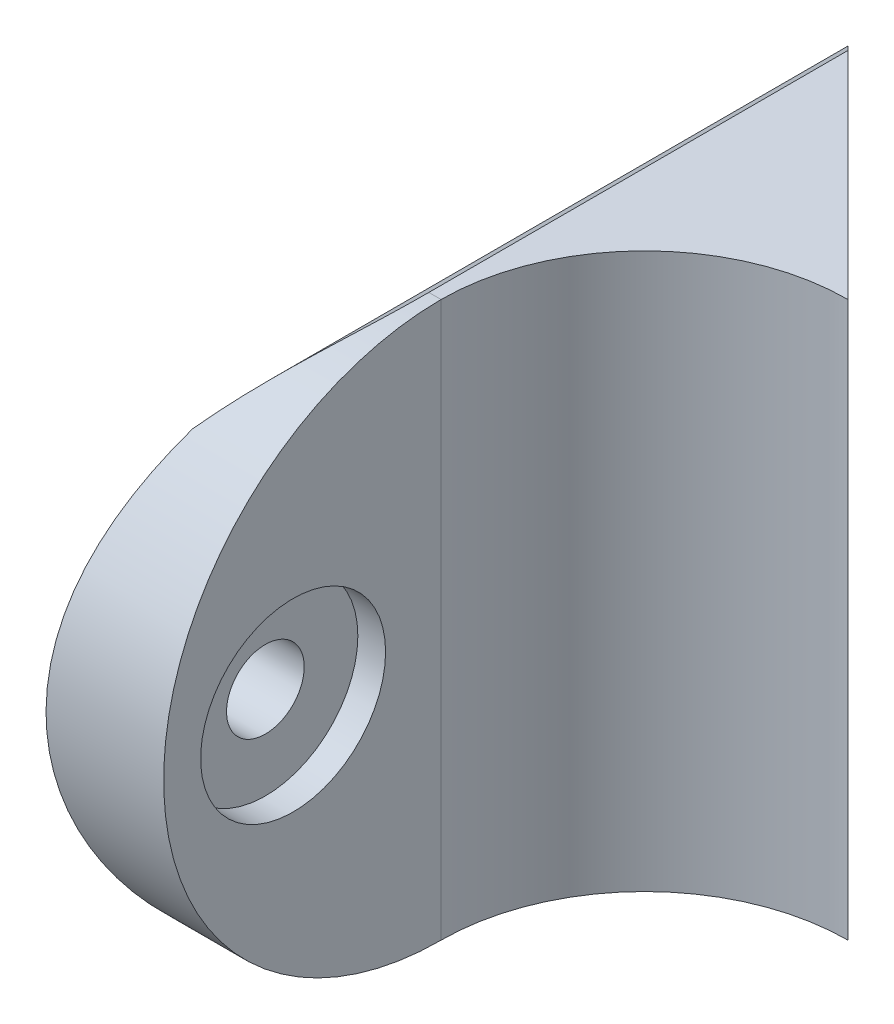
ISO-10303-21;
HEADER;
FILE_DESCRIPTION(('STEP AP214'),'2;1');
FILE_NAME('part.step','',(''),(''),'','','');
FILE_SCHEMA(('AUTOMOTIVE_DESIGN { 1 0 10303 214 1 1 1 1 }'));
ENDSEC;
DATA;
#1=APPLICATION_CONTEXT('core data for automotive mechanical design processes');
#2=APPLICATION_PROTOCOL_DEFINITION('international standard','automotive_design',2000,#1);
#3=PRODUCT_CONTEXT('',#1,'mechanical');
#4=PRODUCT('Part','Part','',(#3));
#5=PRODUCT_RELATED_PRODUCT_CATEGORY('part','',(#4));
#6=PRODUCT_DEFINITION_FORMATION('','',#4);
#7=PRODUCT_DEFINITION_CONTEXT('part definition',#1,'design');
#8=PRODUCT_DEFINITION('design','',#6,#7);
#9=PRODUCT_DEFINITION_SHAPE('','',#8);
#10=(LENGTH_UNIT() NAMED_UNIT(*) SI_UNIT(.MILLI.,.METRE.));
#11=(NAMED_UNIT(*) PLANE_ANGLE_UNIT() SI_UNIT($,.RADIAN.));
#12=(NAMED_UNIT(*) SI_UNIT($,.STERADIAN.) SOLID_ANGLE_UNIT());
#13=UNCERTAINTY_MEASURE_WITH_UNIT(LENGTH_MEASURE(1.E-05),#10,'distance_accuracy_value','');
#14=(GEOMETRIC_REPRESENTATION_CONTEXT(3) GLOBAL_UNCERTAINTY_ASSIGNED_CONTEXT((#13)) GLOBAL_UNIT_ASSIGNED_CONTEXT((#10,
#11,#12)) REPRESENTATION_CONTEXT('',''));
#15=CARTESIAN_POINT('',(0.,0.,0.));
#16=DIRECTION('',(0.,0.,1.));
#17=DIRECTION('',(1.,0.,0.));
#18=AXIS2_PLACEMENT_3D('',#15,#16,#17);
#19=CARTESIAN_POINT('',(-21.,0.,43.));
#20=DIRECTION('',(1.,0.,0.));
#21=DIRECTION('',(0.,0.,-1.));
#22=AXIS2_PLACEMENT_3D('',#19,#20,#21);
#23=CYLINDRICAL_SURFACE('',#22,2.1);
#24=CARTESIAN_POINT('',(-17.359878327988,0.,40.9));
#25=CARTESIAN_POINT('',(-17.3598773552782,0.117803127326626,40.9000051715138));
#26=CARTESIAN_POINT('',(-17.3591769189348,0.235687990237266,40.9099458752845));
#27=CARTESIAN_POINT('',(-17.3564500802148,0.468200495144243,40.9494574222357));
#28=CARTESIAN_POINT('',(-17.3544221480234,0.582824219765412,40.9790509139868));
#29=CARTESIAN_POINT('',(-17.3492696501639,0.805412984687269,41.057011968129));
#30=CARTESIAN_POINT('',(-17.3461456768738,0.913381584901175,41.1053693906611));
#31=CARTESIAN_POINT('',(-17.3391521206936,1.11964183281974,41.2194686016767));
#32=CARTESIAN_POINT('',(-17.3352827049107,1.21793564189313,41.2852064951746));
#33=CARTESIAN_POINT('',(-17.3272249871438,1.40226466954753,41.4323324826434));
#34=CARTESIAN_POINT('',(-17.3230361760479,1.48827966156545,41.5137458920299));
#35=CARTESIAN_POINT('',(-17.3148160910453,1.64543619165883,41.6898591159669));
#36=CARTESIAN_POINT('',(-17.3107848238353,1.71657709804234,41.7845594945203));
#37=CARTESIAN_POINT('',(-17.3033304060286,1.842030986409,41.9846763953724));
#38=CARTESIAN_POINT('',(-17.2999078791114,1.89632675174785,42.0901037360624));
#39=CARTESIAN_POINT('',(-17.294063646182,1.98643902574917,42.3086061849361));
#40=CARTESIAN_POINT('',(-17.2916419271516,2.02225577478247,42.4216811936191));
#41=CARTESIAN_POINT('',(-17.2880773537148,2.07433608374194,42.6520709006064));
#42=CARTESIAN_POINT('',(-17.2869323907341,2.0906318860072,42.7693782772777));
#43=CARTESIAN_POINT('',(-17.2860441395963,2.10330728173906,43.0050684978444));
#44=CARTESIAN_POINT('',(-17.2863008321518,2.09968714925843,43.1234513269187));
#45=CARTESIAN_POINT('',(-17.288184988244,2.07266015147577,43.3577118930659));
#46=CARTESIAN_POINT('',(-17.2898100313425,2.04928822432188,43.4735936831836));
#47=CARTESIAN_POINT('',(-17.294243961714,1.98347530194872,43.699785343894));
#48=CARTESIAN_POINT('',(-17.2970528575516,1.94103416877251,43.8100951741698));
#49=CARTESIAN_POINT('',(-17.3035407555352,1.83824809666536,44.0221235816733));
#50=CARTESIAN_POINT('',(-17.3072205245734,1.77788736572298,44.1238344789118));
#51=CARTESIAN_POINT('',(-17.3150347626347,1.64098693859051,44.3156938548685));
#52=CARTESIAN_POINT('',(-17.3191692381136,1.56444701267509,44.4058421693827));
#53=CARTESIAN_POINT('',(-17.3274377463794,1.3971643747123,44.5722206327364));
#54=CARTESIAN_POINT('',(-17.3315717590453,1.30639143669282,44.6484203956559));
#55=CARTESIAN_POINT('',(-17.3393649647355,1.11332527716711,44.7845041628899));
#56=CARTESIAN_POINT('',(-17.3430241575511,1.01103205059867,44.8443881600351));
#57=CARTESIAN_POINT('',(-17.3494558192857,0.797810177565241,44.9461381614192));
#58=CARTESIAN_POINT('',(-17.3522282284191,0.686880949501239,44.9880029508973));
#59=CARTESIAN_POINT('',(-17.3565731691071,0.459544449340323,45.0525055325618));
#60=CARTESIAN_POINT('',(-17.3581457182389,0.343137257519005,45.0751436064091));
#61=CARTESIAN_POINT('',(-17.3599114850407,0.108412754163054,45.1005123479051));
#62=CARTESIAN_POINT('',(-17.3601076126284,-0.00989999733750644,45.103285013631));
#63=CARTESIAN_POINT('',(-17.359106187304,-0.245308816982658,45.0889540612662));
#64=CARTESIAN_POINT('',(-17.3579086435222,-0.36240489309282,45.0718505733873));
#65=CARTESIAN_POINT('',(-17.3542565154343,-0.591937652970691,45.0182876049569));
#66=CARTESIAN_POINT('',(-17.3518031868102,-0.704378870053084,44.9818474581486));
#67=CARTESIAN_POINT('',(-17.3459153591273,-0.921550206949607,44.890665245067));
#68=CARTESIAN_POINT('',(-17.3424808490262,-1.02628023996477,44.8359229728191));
#69=CARTESIAN_POINT('',(-17.3350090157935,-1.2252482421634,44.709583977226));
#70=CARTESIAN_POINT('',(-17.330970696209,-1.31946840973544,44.6379592784042));
#71=CARTESIAN_POINT('',(-17.3227488162683,-1.49456275117412,44.47992920989));
#72=CARTESIAN_POINT('',(-17.3185652541268,-1.57543676092761,44.393523658469));
#73=CARTESIAN_POINT('',(-17.3105159077264,-1.72168592952491,44.2082030768615));
#74=CARTESIAN_POINT('',(-17.3066506908837,-1.78703378925954,44.1092664750551));
#75=CARTESIAN_POINT('',(-17.2996830415473,-1.90018879653537,43.9018003072294));
#76=CARTESIAN_POINT('',(-17.2965806033839,-1.94799607445812,43.7932708125227));
#77=CARTESIAN_POINT('',(-17.2914925094567,-2.02466582187833,43.5697983232938));
#78=CARTESIAN_POINT('',(-17.2895058501819,-2.05354531858909,43.4548611943006));
#79=CARTESIAN_POINT('',(-17.2868705962817,-2.09159527512911,43.2217549881252));
#80=CARTESIAN_POINT('',(-17.2862219843291,-2.10076599017902,43.103585952815));
#81=CARTESIAN_POINT('',(-17.2863363975873,-2.09913546278256,42.8676416864513));
#82=CARTESIAN_POINT('',(-17.2870963900514,-2.08837712791074,42.7498661550138));
#83=CARTESIAN_POINT('',(-17.2899359438148,-2.04728302027896,42.5177984445883));
#84=CARTESIAN_POINT('',(-17.2920155073976,-2.01694721364218,42.4035062716284));
#85=CARTESIAN_POINT('',(-17.2972591064403,-1.9375693863946,42.1816444572387));
#86=CARTESIAN_POINT('',(-17.3004231191017,-1.88852775903646,42.0740746745395));
#87=CARTESIAN_POINT('',(-17.3074790730021,-1.77313580434715,41.8686893281596));
#88=CARTESIAN_POINT('',(-17.3113709978327,-1.7067858671601,41.7708735446841));
#89=CARTESIAN_POINT('',(-17.3194540791258,-1.55850069282034,41.5875542452822));
#90=CARTESIAN_POINT('',(-17.3236458272448,-1.47653407717275,41.5020761377643));
#91=CARTESIAN_POINT('',(-17.3318509910896,-1.29939133458257,41.3460612211671));
#92=CARTESIAN_POINT('',(-17.3358643630974,-1.20421199265805,41.275528059146));
#93=CARTESIAN_POINT('',(-17.3432657042034,-1.00321297828269,41.1513395555124));
#94=CARTESIAN_POINT('',(-17.3466527653414,-0.897378196452628,41.0977086389546));
#95=CARTESIAN_POINT('',(-17.3524082880172,-0.678257832048794,41.0090444950348));
#96=CARTESIAN_POINT('',(-17.354777934675,-0.564981096517255,40.9739896184374));
#97=CARTESIAN_POINT('',(-17.3576147822055,-0.375849385227733,40.9325238403764));
#98=CARTESIAN_POINT('',(-17.3584598095428,-0.30121502132771,40.9203433143235));
#99=CARTESIAN_POINT('',(-17.3595918938459,-0.151064976224547,40.9040797430476));
#100=CARTESIAN_POINT('',(-17.3598789518046,-0.0755492965900784,40.8999966834138));
#101=CARTESIAN_POINT('',(-17.359878327988,0.,40.9));
#102=B_SPLINE_CURVE_WITH_KNOTS('',3,(#24,#25,#26,#27,#28,#29,#30,#31,#32,#33,#34,#35,#36,#37,
#38,#39,#40,#41,#42,#43,#44,#45,#46,#47,#48,#49,#50,#51,#52,#53,#54,#55,#56,#57,#58,#59,#60,#61,
#62,#63,#64,#65,#66,#67,#68,#69,#70,#71,#72,#73,#74,#75,#76,#77,#78,#79,#80,#81,#82,#83,#84,#85,
#86,#87,#88,#89,#90,#91,#92,#93,#94,#95,#96,#97,#98,#99,#100,#101),.UNSPECIFIED.,.T.,.F.,(4,2,2,
2,2,2,2,2,2,2,2,2,2,2,2,2,2,2,2,2,2,2,2,2,2,2,2,2,2,2,2,2,2,2,2,2,2,2,4),(0.,0.353133570045961,
0.706674811626607,1.0600252681825,1.41329660547348,1.76714332299056,2.12100506507728,
2.47522729052506,2.82944490821496,3.18307666183501,3.53670354932543,3.88970622664898,
4.24271145782552,4.59602871024467,4.94935097968591,5.30343400717363,5.65751719025207,
6.01162424003237,6.36572610224504,6.71907912519491,7.07242983328402,7.42542790780287,
7.77842995514697,8.13202111813854,8.48561662879608,8.83982932832678,9.19403939489244,
9.54793037921384,9.90181678076442,10.2549421444365,10.6080681191573,10.9611866705163,
11.3142972629687,11.6681249871039,12.0220389576475,12.3764620408358,12.7304711521256,
12.956942561706,13.1834135682469),.UNSPECIFIED.);
#103=CARTESIAN_POINT('',(-17.359878327988,0.,40.9));
#104=VERTEX_POINT('',#103);
#105=EDGE_CURVE('E131',#104,#104,#102,.T.);
#106=ORIENTED_EDGE('',*,*,#105,.F.);
#107=EDGE_LOOP('',(#106));
#108=FACE_BOUND('',#107,.T.);
#109=CARTESIAN_POINT('',(-12.5,0.,43.));
#110=DIRECTION('',(1.,0.,0.));
#111=DIRECTION('',(0.,0.,-1.));
#112=AXIS2_PLACEMENT_3D('',#109,#110,#111);
#113=CIRCLE('',#112,2.1);
#114=CARTESIAN_POINT('',(-12.5,0.,40.9));
#115=VERTEX_POINT('',#114);
#116=EDGE_CURVE('E40',#115,#115,#113,.F.);
#117=ORIENTED_EDGE('',*,*,#116,.F.);
#118=EDGE_LOOP('',(#117));
#119=FACE_BOUND('',#118,.T.);
#120=ADVANCED_FACE('F35',(#108,#119),#23,.F.);
#121=CARTESIAN_POINT('',(-11.,-15.,35.));
#122=DIRECTION('',(-1.,0.,0.));
#123=DIRECTION('',(0.,0.,1.));
#124=AXIS2_PLACEMENT_3D('',#121,#122,#123);
#125=PLANE('',#124);
#126=CARTESIAN_POINT('',(-11.,0.,43.));
#127=DIRECTION('',(1.,0.,0.));
#128=DIRECTION('',(0.,0.,-1.));
#129=AXIS2_PLACEMENT_3D('',#126,#127,#128);
#130=CIRCLE('',#129,5.);
#131=CARTESIAN_POINT('',(-11.,0.,38.));
#132=VERTEX_POINT('',#131);
#133=EDGE_CURVE('E337',#132,#132,#130,.T.);
#134=ORIENTED_EDGE('',*,*,#133,.F.);
#135=EDGE_LOOP('',(#134));
#136=FACE_BOUND('',#135,.T.);
#137=CARTESIAN_POINT('',(-11.,0.,35.));
#138=DIRECTION('',(-1.,0.,0.));
#139=DIRECTION('',(0.,0.,1.));
#140=AXIS2_PLACEMENT_3D('',#137,#138,#139);
#141=CIRCLE('',#140,15.);
#142=CARTESIAN_POINT('',(-11.,15.,35.));
#143=VERTEX_POINT('',#142);
#144=CARTESIAN_POINT('',(-11.,-15.,35.));
#145=VERTEX_POINT('',#144);
#146=EDGE_CURVE('E11',#143,#145,#141,.F.);
#147=ORIENTED_EDGE('',*,*,#146,.T.);
#148=DIRECTION('',(0.,1.,0.));
#149=VECTOR('',#148,1.);
#150=CARTESIAN_POINT('',(-11.,-15.,35.));
#151=LINE('',#150,#149);
#152=EDGE_CURVE('E137',#145,#143,#151,.T.);
#153=ORIENTED_EDGE('',*,*,#152,.T.);
#154=EDGE_LOOP('',(#147,#153));
#155=FACE_BOUND('',#154,.T.);
#156=ADVANCED_FACE('F142',(#136,#155),#125,.F.);
#157=CARTESIAN_POINT('',(12.6351057446877,0.,50.));
#158=DIRECTION('',(0.,0.,-1.));
#159=DIRECTION('',(-1.,0.,0.));
#160=AXIS2_PLACEMENT_3D('',#157,#158,#159);
#161=CYLINDRICAL_SURFACE('',#160,29.9949840726757);
#162=ORIENTED_EDGE('',*,*,#105,.T.);
#163=EDGE_LOOP('',(#162));
#164=FACE_BOUND('',#163,.T.);
#165=DIRECTION('',(0.,0.,-1.));
#166=VECTOR('',#165,1.);
#167=CARTESIAN_POINT('',(-15.,-11.6619037896906,50.));
#168=LINE('',#167,#166);
#169=CARTESIAN_POINT('',(-15.,-11.6619037896906,44.4339811320566));
#170=VERTEX_POINT('',#169);
#171=CARTESIAN_POINT('',(-15.,-11.6619037896906,9.00000000000016));
#172=VERTEX_POINT('',#171);
#173=EDGE_CURVE('E151',#170,#172,#168,.T.);
#174=ORIENTED_EDGE('',*,*,#173,.F.);
#175=CARTESIAN_POINT('',(-15.,-11.6619037896906,44.4339811320566));
#176=CARTESIAN_POINT('',(-15.1120957211379,-11.3963216706343,44.7622791990855));
#177=CARTESIAN_POINT('',(-15.2254042103931,-11.1170818582388,45.0791155664624));
#178=CARTESIAN_POINT('',(-15.4515199959078,-10.5327284268078,45.6883039807991));
#179=CARTESIAN_POINT('',(-15.5643271656971,-10.2276086300261,45.9806501484744));
#180=CARTESIAN_POINT('',(-15.7869155074399,-9.59175586830694,46.5402910792367));
#181=CARTESIAN_POINT('',(-15.8966822677662,-9.26092238306328,46.8074774621032));
#182=CARTESIAN_POINT('',(-16.1098474105829,-8.57643166097236,47.313650221142));
#183=CARTESIAN_POINT('',(-16.2132462442515,-8.22277604475586,47.5526385962921));
#184=CARTESIAN_POINT('',(-16.4111985812117,-7.49361823023179,48.0011273094045));
#185=CARTESIAN_POINT('',(-16.5057302168057,-7.11806554374308,48.2105553574182));
#186=CARTESIAN_POINT('',(-16.6830932650888,-6.34809605883984,48.5973257914563));
#187=CARTESIAN_POINT('',(-16.765924402544,-5.95367881696145,48.774667422731));
#188=CARTESIAN_POINT('',(-16.9173835086777,-5.1494211602852,49.0950504029862));
#189=CARTESIAN_POINT('',(-16.9860392292979,-4.73961277382633,49.2381588608545));
#190=CARTESIAN_POINT('',(-17.1073184377961,-3.90694348283946,49.4887808458075));
#191=CARTESIAN_POINT('',(-17.1599434207373,-3.4840837995587,49.5962976923285));
#192=CARTESIAN_POINT('',(-17.2444907199793,-2.65870389589838,49.7680869399939));
#193=CARTESIAN_POINT('',(-17.2776014404965,-2.25682344368792,49.8348534466609));
#194=CARTESIAN_POINT('',(-17.3276479381946,-1.4479658783483,49.9355099384572));
#195=CARTESIAN_POINT('',(-17.3445844305725,-1.04098899138116,49.9694013772674));
#196=CARTESIAN_POINT('',(-17.3618070818824,-0.225253662544106,50.0038638693639));
#197=CARTESIAN_POINT('',(-17.3620923377367,0.18350487475105,50.0044331154251));
#198=CARTESIAN_POINT('',(-17.3460013578525,0.999366724908656,49.9722380603422));
#199=CARTESIAN_POINT('',(-17.32962578213,1.40647010269855,49.9394750796486));
#200=CARTESIAN_POINT('',(-17.2824273703869,2.18678551993687,49.8445702083344));
#201=CARTESIAN_POINT('',(-17.2527185994086,2.56034337701187,49.7846910659505));
#202=CARTESIAN_POINT('',(-17.1800471819322,3.30061073420406,49.6372262221396));
#203=CARTESIAN_POINT('',(-17.13708525722,3.66732060611929,49.5496420295632));
#204=CARTESIAN_POINT('',(-17.038894279801,4.39162787101356,49.3476476263607));
#205=CARTESIAN_POINT('',(-16.9836636291772,4.74922407023061,49.2332339212676));
#206=CARTESIAN_POINT('',(-16.862172392532,5.45318764214694,48.9786571045386));
#207=CARTESIAN_POINT('',(-16.7959115317523,5.79955473487665,48.8384933514699));
#208=CARTESIAN_POINT('',(-16.6512467393913,6.49137363188892,48.5281516158495));
#209=CARTESIAN_POINT('',(-16.5724938714589,6.83635174257776,48.357081093172));
#210=CARTESIAN_POINT('',(-16.4064278762627,7.51059062207698,47.9899347680066));
#211=CARTESIAN_POINT('',(-16.3191140768805,7.83985015380031,47.7938570018374));
#212=CARTESIAN_POINT('',(-16.1378247180322,8.48106888287473,47.3781036263377));
#213=CARTESIAN_POINT('',(-16.0438505189569,8.79303159004555,47.1584328312016));
#214=CARTESIAN_POINT('',(-15.8512253277107,9.39834553916119,46.6968348920091));
#215=CARTESIAN_POINT('',(-15.7525755028993,9.69170138434198,46.4549132892531));
#216=CARTESIAN_POINT('',(-15.5449964892748,10.2803456738617,45.9307556524684));
#217=CARTESIAN_POINT('',(-15.4358569648111,10.5740767019255,45.6468522553939));
#218=CARTESIAN_POINT('',(-15.2174327724006,11.1367106594027,45.0568119876732));
#219=CARTESIAN_POINT('',(-15.1081490132699,11.4056690538692,44.7507276699081));
#220=CARTESIAN_POINT('',(-15.,11.6619037896906,44.4339811320566));
#221=B_SPLINE_CURVE_WITH_KNOTS('',3,(#175,#176,#177,#178,#179,#180,#181,#182,#183,#184,#185,
#186,#187,#188,#189,#190,#191,#192,#193,#194,#195,#196,#197,#198,#199,#200,#201,#202,#203,#204,
#205,#206,#207,#208,#209,#210,#211,#212,#213,#214,#215,#216,#217,#218,#219,#220),.UNSPECIFIED.,
.F.,.F.,(4,2,2,2,2,2,2,2,2,2,2,2,2,2,2,2,2,2,2,2,2,2,4),(0.,1.31033235921306,2.62097838963238,
3.93703411458703,5.2529964872433,6.57212327282275,7.89128108340413,9.20783129690129,
10.5242586882991,11.7488241747026,12.9733355103838,14.1979132572293,15.4224424945287,
16.559609751518,17.6967150876589,18.8339686108493,19.9712504668295,21.1491144961019,
22.3270710735758,23.5047877422054,24.6822119044985,25.9493923133011,27.2136628346308),.UNSPECIFIED.);
#222=CARTESIAN_POINT('',(-15.,11.6619037896906,44.4339811320566));
#223=VERTEX_POINT('',#222);
#224=EDGE_CURVE('E218',#170,#223,#221,.T.);
#225=ORIENTED_EDGE('',*,*,#224,.T.);
#226=DIRECTION('',(0.,0.,-1.));
#227=VECTOR('',#226,1.);
#228=CARTESIAN_POINT('',(-15.,11.6619037896906,50.));
#229=LINE('',#228,#227);
#230=CARTESIAN_POINT('',(-15.,11.6619037896906,9.00000000000017));
#231=VERTEX_POINT('',#230);
#232=EDGE_CURVE('E143',#223,#231,#229,.T.);
#233=ORIENTED_EDGE('',*,*,#232,.T.);
#234=CARTESIAN_POINT('',(12.6351057446877,0.,36.6351057446876));
#235=DIRECTION('',(-0.707106781186544,0.,0.707106781186551));
#236=DIRECTION('',(-0.707106781186551,0.,-0.707106781186544));
#237=AXIS2_PLACEMENT_3D('',#234,#235,#236);
#238=ELLIPSE('',#237,42.4193132787428,29.9949840726757);
#239=EDGE_CURVE('E276',#231,#172,#238,.T.);
#240=ORIENTED_EDGE('',*,*,#239,.T.);
#241=EDGE_LOOP('',(#174,#225,#233,#240));
#242=FACE_BOUND('',#241,.T.);
#243=CARTESIAN_POINT('',(-16.7536517914871,6.,23.));
#244=CARTESIAN_POINT('',(-16.7241071994618,6.14476772058072,23.0000140300551));
#245=CARTESIAN_POINT('',(-16.6934745392663,6.28930006028608,22.9937135494294));
#246=CARTESIAN_POINT('',(-16.6303293493908,6.5768431082708,22.9687056361636));
#247=CARTESIAN_POINT('',(-16.5978172144413,6.71985412864362,22.9500008001284));
#248=CARTESIAN_POINT('',(-16.5312393506038,7.00318375282971,22.9004377922957));
#249=CARTESIAN_POINT('',(-16.4971756625683,7.14350556718333,22.869595199843));
#250=CARTESIAN_POINT('',(-16.4278040761811,7.42069698571253,22.7960586977326));
#251=CARTESIAN_POINT('',(-16.3924961330744,7.55756646540514,22.7533643613938));
#252=CARTESIAN_POINT('',(-16.3210434778832,7.82687003433335,22.6565022467704));
#253=CARTESIAN_POINT('',(-16.2848992128615,7.95930640473414,22.6023404778055));
#254=CARTESIAN_POINT('',(-16.2121680129478,8.2190058658933,22.4829061656262));
#255=CARTESIAN_POINT('',(-16.1755809202679,8.34626703773404,22.4176295468301));
#256=CARTESIAN_POINT('',(-16.1024404101607,8.5947240050441,22.2764263270041));
#257=CARTESIAN_POINT('',(-16.0658869889588,8.71592059063252,22.2005011182433));
#258=CARTESIAN_POINT('',(-15.9932839105586,8.95151252774411,22.0384431012141));
#259=CARTESIAN_POINT('',(-15.9572344327508,9.06590550226402,21.9523067565379));
#260=CARTESIAN_POINT('',(-15.8856644890068,9.28862799656446,21.7690861258288));
#261=CARTESIAN_POINT('',(-15.8501585798704,9.39684969566051,21.6718649809252));
#262=CARTESIAN_POINT('',(-15.7807605221742,9.60466644122404,21.4680770205888));
#263=CARTESIAN_POINT('',(-15.7468683274909,9.70426173431996,21.361510472516));
#264=CARTESIAN_POINT('',(-15.681257131858,9.89407659654981,21.1396628531722));
#265=CARTESIAN_POINT('',(-15.649538593399,9.98429417247648,21.02437993822));
#266=CARTESIAN_POINT('',(-15.5888665102752,10.154537194338,20.7859061122273));
#267=CARTESIAN_POINT('',(-15.5599117781122,10.2345670225207,20.6627186358556));
#268=CARTESIAN_POINT('',(-15.5060264287856,10.3817983122973,20.412541279752));
#269=CARTESIAN_POINT('',(-15.4810103693098,10.4492805494346,20.2857351186022));
#270=CARTESIAN_POINT('',(-15.434618091201,10.5732708467918,20.0262906591875));
#271=CARTESIAN_POINT('',(-15.4132402664165,10.6297837511392,19.8936549671633));
#272=CARTESIAN_POINT('',(-15.3745626346637,10.7312859945089,19.6234991691105));
#273=CARTESIAN_POINT('',(-15.35726192167,10.7762778939484,19.4859801560958));
#274=CARTESIAN_POINT('',(-15.32711562522,10.8542617170915,19.2071048408265));
#275=CARTESIAN_POINT('',(-15.3142697705776,10.8872543712454,19.0657487727146));
#276=CARTESIAN_POINT('',(-15.2939911184069,10.9391655434075,18.7893942406897));
#277=CARTESIAN_POINT('',(-15.2862673654933,10.9588421833806,18.6545590713513));
#278=CARTESIAN_POINT('',(-15.2751470506439,10.9871330018953,18.3835052882272));
#279=CARTESIAN_POINT('',(-15.2717519559223,10.9957434295127,18.2472862211256));
#280=CARTESIAN_POINT('',(-15.2693673046577,11.0017936598887,17.974642036221));
#281=CARTESIAN_POINT('',(-15.2703751786388,10.9992399777765,17.8382170850275));
#282=CARTESIAN_POINT('',(-15.2767703388789,10.9830013740834,17.5660836660844));
#283=CARTESIAN_POINT('',(-15.2821592294546,10.9693123747781,17.4303754791384));
#284=CARTESIAN_POINT('',(-15.2969109918918,10.9316924284895,17.1660107076168));
#285=CARTESIAN_POINT('',(-15.3061112001783,10.9081804047405,17.037285107826));
#286=CARTESIAN_POINT('',(-15.3282805502141,10.8512224980794,16.782335342054));
#287=CARTESIAN_POINT('',(-15.3412510208893,10.8177731123969,16.6561120748706));
#288=CARTESIAN_POINT('',(-15.3707153794152,10.7412629729449,16.4070819864835));
#289=CARTESIAN_POINT('',(-15.3872081754824,10.6982051972161,16.2842741199397));
#290=CARTESIAN_POINT('',(-15.4234338185301,10.6028311779587,16.0427540107706));
#291=CARTESIAN_POINT('',(-15.4431678906518,10.5505114329958,15.9240433374184));
#292=CARTESIAN_POINT('',(-15.4860586606735,10.4356612513978,15.6886214724238));
#293=CARTESIAN_POINT('',(-15.5092869844059,10.3729132505822,15.5720293091016));
#294=CARTESIAN_POINT('',(-15.5584067882484,10.2386541030471,15.3445753951962));
#295=CARTESIAN_POINT('',(-15.5842992476877,10.1671397319714,15.2337157745431));
#296=CARTESIAN_POINT('',(-15.6653619722555,9.94023854192202,14.9107236364847));
#297=CARTESIAN_POINT('',(-15.7239519129918,9.77240342505809,14.707994065463));
#298=CARTESIAN_POINT('',(-15.8506005624361,9.39708336696672,14.320726929444));
#299=CARTESIAN_POINT('',(-15.9190194473154,9.18779936830643,14.1380645147341));
#300=CARTESIAN_POINT('',(-16.058552244608,8.74227588840535,13.8099663264959));
#301=CARTESIAN_POINT('',(-16.1296677247335,8.50602056133963,13.6645526012177));
#302=CARTESIAN_POINT('',(-16.2371978936146,8.13063658497722,13.4743704493698));
#303=CARTESIAN_POINT('',(-16.273978661793,7.99895420565085,13.4146862193198));
#304=CARTESIAN_POINT('',(-16.3468471185572,7.7307654978217,13.3068876773466));
#305=CARTESIAN_POINT('',(-16.3829350485322,7.5942608982767,13.2587692659511));
#306=CARTESIAN_POINT('',(-16.4539585687181,7.31750004000683,13.1745359937125));
#307=CARTESIAN_POINT('',(-16.4888954457064,7.17724831164613,13.1384072888194));
#308=CARTESIAN_POINT('',(-16.5572760945009,6.89384789452412,13.0784152867375));
#309=CARTESIAN_POINT('',(-16.590720604173,6.75070068940507,13.0545458654778));
#310=CARTESIAN_POINT('',(-16.6459471668589,6.50612218059689,13.0246515785438));
#311=CARTESIAN_POINT('',(-16.6681953983225,6.40517766084863,13.0154124076141));
#312=CARTESIAN_POINT('',(-16.7116878527669,6.20286203367368,13.0030903228098));
#313=CARTESIAN_POINT('',(-16.7329335694874,6.10149182285266,12.9999979480455));
#314=CARTESIAN_POINT('',(-16.7536517914871,6.,13.));
#315=B_SPLINE_CURVE_WITH_KNOTS('',3,(#243,#244,#245,#246,#247,#248,#249,#250,#251,#252,#253,
#254,#255,#256,#257,#258,#259,#260,#261,#262,#263,#264,#265,#266,#267,#268,#269,#270,#271,#272,
#273,#274,#275,#276,#277,#278,#279,#280,#281,#282,#283,#284,#285,#286,#287,#288,#289,#290,#291,
#292,#293,#294,#295,#296,#297,#298,#299,#300,#301,#302,#303,#304,#305,#306,#307,#308,#309,#310,
#311,#312,#313,#314),.UNSPECIFIED.,.F.,.F.,(4,2,2,2,2,2,2,2,2,2,2,2,2,2,2,2,2,2,2,2,2,2,2,2,2,2,
2,2,2,2,2,2,2,2,2,4),(0.,0.443097954722576,0.886103184975367,1.32854164342903,1.77099603242137,
2.21321913180244,2.65560473567035,3.09793255286307,3.54041401082463,3.98911460737901,
4.43780237137204,4.88658530850759,5.33517454515727,5.77203109942625,6.2086942939273,
6.64526036042101,7.08179984663601,7.49073164819942,7.89980202183829,8.30863370287517,
8.7176151644519,9.11069458497478,9.50391272479662,9.8970091587735,10.2902545191912,
10.693073114992,11.0960403184675,11.901359010533,12.7560097847405,13.6111652810369,
14.058273253735,14.5052225157816,14.9516538924924,15.3978620389436,15.7090228693402,
16.0197044021007),.UNSPECIFIED.);
#316=CARTESIAN_POINT('',(-16.7536517914871,6.,23.));
#317=VERTEX_POINT('',#316);
#318=CARTESIAN_POINT('',(-16.7536517914871,6.,13.));
#319=VERTEX_POINT('',#318);
#320=EDGE_CURVE('E45',#317,#319,#315,.T.);
#321=ORIENTED_EDGE('',*,*,#320,.F.);
#322=CARTESIAN_POINT('',(12.6351057446877,0.,23.));
#323=DIRECTION('',(0.,0.,-1.));
#324=DIRECTION('',(-1.,0.,0.));
#325=AXIS2_PLACEMENT_3D('',#322,#323,#324);
#326=CIRCLE('',#325,29.9949840726757);
#327=CARTESIAN_POINT('',(-16.7536517914871,-6.,23.));
#328=VERTEX_POINT('',#327);
#329=EDGE_CURVE('E153',#328,#317,#326,.T.);
#330=ORIENTED_EDGE('',*,*,#329,.F.);
#331=CARTESIAN_POINT('',(-16.7536517914871,-6.,13.));
#332=CARTESIAN_POINT('',(-16.7241071994618,-6.14476772058072,12.9999859699449));
#333=CARTESIAN_POINT('',(-16.6934745392663,-6.28930006028609,13.0062864505706));
#334=CARTESIAN_POINT('',(-16.6303293493908,-6.5768431082708,13.0312943638364));
#335=CARTESIAN_POINT('',(-16.5978172144413,-6.71985412864362,13.0499991998716));
#336=CARTESIAN_POINT('',(-16.5312393506038,-7.00318375282971,13.0995622077043));
#337=CARTESIAN_POINT('',(-16.4971756625683,-7.14350556718333,13.130404800157));
#338=CARTESIAN_POINT('',(-16.4278040761811,-7.42069698571254,13.2039413022674));
#339=CARTESIAN_POINT('',(-16.3924961330744,-7.55756646540514,13.2466356386062));
#340=CARTESIAN_POINT('',(-16.3210434778832,-7.82687003433335,13.3434977532296));
#341=CARTESIAN_POINT('',(-16.2848992128615,-7.95930640473414,13.3976595221945));
#342=CARTESIAN_POINT('',(-16.2121680129478,-8.2190058658933,13.5170938343738));
#343=CARTESIAN_POINT('',(-16.1755809202679,-8.34626703773405,13.5823704531699));
#344=CARTESIAN_POINT('',(-16.1024404101607,-8.59472400504411,13.7235736729959));
#345=CARTESIAN_POINT('',(-16.0658869889588,-8.71592059063253,13.7994988817567));
#346=CARTESIAN_POINT('',(-15.9932839105586,-8.95151252774412,13.9615568987859));
#347=CARTESIAN_POINT('',(-15.9572344327508,-9.06590550226403,14.0476932434621));
#348=CARTESIAN_POINT('',(-15.8856644890068,-9.28862799656447,14.2309138741712));
#349=CARTESIAN_POINT('',(-15.8501585798704,-9.39684969566051,14.3281350190748));
#350=CARTESIAN_POINT('',(-15.7807605221742,-9.60466644122404,14.5319229794112));
#351=CARTESIAN_POINT('',(-15.7468683274909,-9.70426173431997,14.638489527484));
#352=CARTESIAN_POINT('',(-15.681257131858,-9.89407659654981,14.8603371468278));
#353=CARTESIAN_POINT('',(-15.649538593399,-9.98429417247648,14.97562006178));
#354=CARTESIAN_POINT('',(-15.5888665102752,-10.154537194338,15.2140938877727));
#355=CARTESIAN_POINT('',(-15.5599117781122,-10.2345670225207,15.3372813641444));
#356=CARTESIAN_POINT('',(-15.5060264287856,-10.3817983122973,15.587458720248));
#357=CARTESIAN_POINT('',(-15.4810103693098,-10.4492805494346,15.7142648813978));
#358=CARTESIAN_POINT('',(-15.434618091201,-10.5732708467918,15.9737093408125));
#359=CARTESIAN_POINT('',(-15.4132402664165,-10.6297837511392,16.1063450328367));
#360=CARTESIAN_POINT('',(-15.3745626346637,-10.7312859945089,16.3765008308895));
#361=CARTESIAN_POINT('',(-15.35726192167,-10.7762778939484,16.5140198439042));
#362=CARTESIAN_POINT('',(-15.3271156252199,-10.8542617170915,16.7928951591735));
#363=CARTESIAN_POINT('',(-15.3142697705776,-10.8872543712454,16.9342512272854));
#364=CARTESIAN_POINT('',(-15.2939911184069,-10.9391655434075,17.2106057593103));
#365=CARTESIAN_POINT('',(-15.2862673654933,-10.9588421833807,17.3454409286487));
#366=CARTESIAN_POINT('',(-15.2751470506439,-10.9871330018953,17.6164947117728));
#367=CARTESIAN_POINT('',(-15.2717519559223,-10.9957434295127,17.7527137788744));
#368=CARTESIAN_POINT('',(-15.2693673046577,-11.0017936598887,18.025357963779));
#369=CARTESIAN_POINT('',(-15.2703751786388,-10.9992399777765,18.1617829149725));
#370=CARTESIAN_POINT('',(-15.2767703388789,-10.9830013740834,18.4339163339156));
#371=CARTESIAN_POINT('',(-15.2821592294546,-10.9693123747781,18.5696245208616));
#372=CARTESIAN_POINT('',(-15.2969109918918,-10.9316924284895,18.8339892923832));
#373=CARTESIAN_POINT('',(-15.3061112001783,-10.9081804047405,18.962714892174));
#374=CARTESIAN_POINT('',(-15.3282805502141,-10.8512224980794,19.217664657946));
#375=CARTESIAN_POINT('',(-15.3412510208893,-10.8177731123969,19.3438879251294));
#376=CARTESIAN_POINT('',(-15.3707153794152,-10.7412629729449,19.5929180135165));
#377=CARTESIAN_POINT('',(-15.3872081754824,-10.6982051972162,19.7157258800603));
#378=CARTESIAN_POINT('',(-15.4234338185301,-10.6028311779587,19.9572459892294));
#379=CARTESIAN_POINT('',(-15.4431678906518,-10.5505114329958,20.0759566625816));
#380=CARTESIAN_POINT('',(-15.4860586606735,-10.4356612513978,20.3113785275762));
#381=CARTESIAN_POINT('',(-15.5092869844059,-10.3729132505822,20.4279706908984));
#382=CARTESIAN_POINT('',(-15.5584067882484,-10.2386541030471,20.6554246048038));
#383=CARTESIAN_POINT('',(-15.5842992476877,-10.1671397319714,20.7662842254569));
#384=CARTESIAN_POINT('',(-15.6653619722555,-9.94023854192203,21.0892763635153));
#385=CARTESIAN_POINT('',(-15.7239519129918,-9.77240342505809,21.292005934537));
#386=CARTESIAN_POINT('',(-15.8506005624361,-9.39708336696672,21.679273070556));
#387=CARTESIAN_POINT('',(-15.9190194473154,-9.18779936830644,21.8619354852659));
#388=CARTESIAN_POINT('',(-16.058552244608,-8.74227588840535,22.1900336735041));
#389=CARTESIAN_POINT('',(-16.1296677247335,-8.50602056133964,22.3354473987823));
#390=CARTESIAN_POINT('',(-16.2371978936147,-8.13063658497722,22.5256295506302));
#391=CARTESIAN_POINT('',(-16.273978661793,-7.99895420565086,22.5853137806802));
#392=CARTESIAN_POINT('',(-16.3468471185572,-7.73076549782171,22.6931123226534));
#393=CARTESIAN_POINT('',(-16.3829350485322,-7.5942608982767,22.7412307340489));
#394=CARTESIAN_POINT('',(-16.4539585687181,-7.31750004000683,22.8254640062875));
#395=CARTESIAN_POINT('',(-16.4888954457064,-7.17724831164614,22.8615927111806));
#396=CARTESIAN_POINT('',(-16.5572760945009,-6.89384789452413,22.9215847132625));
#397=CARTESIAN_POINT('',(-16.590720604173,-6.75070068940507,22.9454541345222));
#398=CARTESIAN_POINT('',(-16.6459471668589,-6.50612218059689,22.9753484214562));
#399=CARTESIAN_POINT('',(-16.6681953983225,-6.40517766084863,22.9845875923859));
#400=CARTESIAN_POINT('',(-16.7116878527669,-6.20286203367369,22.9969096771902));
#401=CARTESIAN_POINT('',(-16.7329335694874,-6.10149182285267,23.0000020519545));
#402=CARTESIAN_POINT('',(-16.7536517914871,-6.,23.));
#403=B_SPLINE_CURVE_WITH_KNOTS('',3,(#331,#332,#333,#334,#335,#336,#337,#338,#339,#340,#341,
#342,#343,#344,#345,#346,#347,#348,#349,#350,#351,#352,#353,#354,#355,#356,#357,#358,#359,#360,
#361,#362,#363,#364,#365,#366,#367,#368,#369,#370,#371,#372,#373,#374,#375,#376,#377,#378,#379,
#380,#381,#382,#383,#384,#385,#386,#387,#388,#389,#390,#391,#392,#393,#394,#395,#396,#397,#398,
#399,#400,#401,#402),.UNSPECIFIED.,.F.,.F.,(4,2,2,2,2,2,2,2,2,2,2,2,2,2,2,2,2,2,2,2,2,2,2,2,2,2,
2,2,2,2,2,2,2,2,2,4),(0.,0.443097954722578,0.886103184975368,1.32854164342903,1.77099603242137,
2.21321913180244,2.65560473567035,3.09793255286308,3.54041401082464,3.98911460737901,
4.43780237137204,4.88658530850758,5.33517454515727,5.77203109942625,6.2086942939273,
6.64526036042101,7.08179984663601,7.49073164819942,7.89980202183829,8.30863370287517,
8.7176151644519,9.11069458497478,9.50391272479662,9.89700915877349,10.2902545191912,
10.693073114992,11.0960403184675,11.901359010533,12.7560097847405,13.6111652810369,
14.058273253735,14.5052225157815,14.9516538924924,15.3978620389436,15.7090228693402,
16.0197044021007),.UNSPECIFIED.);
#404=CARTESIAN_POINT('',(-16.7536517914871,-6.,13.));
#405=VERTEX_POINT('',#404);
#406=EDGE_CURVE('E166',#405,#328,#403,.T.);
#407=ORIENTED_EDGE('',*,*,#406,.F.);
#408=CARTESIAN_POINT('',(12.6351057446877,0.,13.));
#409=DIRECTION('',(0.,0.,1.));
#410=DIRECTION('',(0.,-1.,0.));
#411=AXIS2_PLACEMENT_3D('',#408,#409,#410);
#412=CIRCLE('',#411,29.9949840726757);
#413=EDGE_CURVE('E173',#319,#405,#412,.T.);
#414=ORIENTED_EDGE('',*,*,#413,.F.);
#415=EDGE_LOOP('',(#321,#330,#407,#414));
#416=FACE_BOUND('',#415,.T.);
#417=ADVANCED_FACE('F37',(#164,#242,#416),#161,.T.);
#418=CARTESIAN_POINT('',(3.,-6.,18.));
#419=DIRECTION('',(-1.,0.,0.));
#420=DIRECTION('',(0.,0.,1.));
#421=AXIS2_PLACEMENT_3D('',#418,#419,#420);
#422=CYLINDRICAL_SURFACE('',#421,2.5);
#423=CARTESIAN_POINT('',(-6.00000000000006,-6.,18.));
#424=DIRECTION('',(-0.707106781186544,0.,0.707106781186551));
#425=DIRECTION('',(-0.707106781186551,0.,-0.707106781186544));
#426=AXIS2_PLACEMENT_3D('',#423,#424,#425);
#427=ELLIPSE('',#426,3.53553390593276,2.5);
#428=CARTESIAN_POINT('',(-8.50000000000009,-6.,15.5));
#429=VERTEX_POINT('',#428);
#430=EDGE_CURVE('E154',#429,#429,#427,.F.);
#431=ORIENTED_EDGE('',*,*,#430,.T.);
#432=EDGE_LOOP('',(#431));
#433=FACE_BOUND('',#432,.T.);
#434=CARTESIAN_POINT('',(-14.,-6.,18.));
#435=DIRECTION('',(-1.,0.,0.));
#436=DIRECTION('',(0.,0.,1.));
#437=AXIS2_PLACEMENT_3D('',#434,#435,#436);
#438=CIRCLE('',#437,2.5);
#439=CARTESIAN_POINT('',(-14.,-6.,20.5));
#440=VERTEX_POINT('',#439);
#441=EDGE_CURVE('E158',#440,#440,#438,.T.);
#442=ORIENTED_EDGE('',*,*,#441,.T.);
#443=EDGE_LOOP('',(#442));
#444=FACE_BOUND('',#443,.T.);
#445=ADVANCED_FACE('F256',(#433,#444),#422,.F.);
#446=CARTESIAN_POINT('',(3.,6.,18.));
#447=DIRECTION('',(-1.,0.,0.));
#448=DIRECTION('',(0.,0.,1.));
#449=AXIS2_PLACEMENT_3D('',#446,#447,#448);
#450=CYLINDRICAL_SURFACE('',#449,2.5);
#451=CARTESIAN_POINT('',(-6.00000000000006,6.,18.));
#452=DIRECTION('',(-0.707106781186544,0.,0.707106781186551));
#453=DIRECTION('',(-0.707106781186551,0.,-0.707106781186544));
#454=AXIS2_PLACEMENT_3D('',#451,#452,#453);
#455=ELLIPSE('',#454,3.53553390593276,2.5);
#456=CARTESIAN_POINT('',(-8.50000000000009,6.,15.5));
#457=VERTEX_POINT('',#456);
#458=EDGE_CURVE('E157',#457,#457,#455,.F.);
#459=ORIENTED_EDGE('',*,*,#458,.T.);
#460=EDGE_LOOP('',(#459));
#461=FACE_BOUND('',#460,.T.);
#462=CARTESIAN_POINT('',(-14.,6.,18.));
#463=DIRECTION('',(-1.,0.,0.));
#464=DIRECTION('',(0.,0.,1.));
#465=AXIS2_PLACEMENT_3D('',#462,#463,#464);
#466=CIRCLE('',#465,2.5);
#467=CARTESIAN_POINT('',(-14.,6.,20.5));
#468=VERTEX_POINT('',#467);
#469=EDGE_CURVE('E161',#468,#468,#466,.T.);
#470=ORIENTED_EDGE('',*,*,#469,.T.);
#471=EDGE_LOOP('',(#470));
#472=FACE_BOUND('',#471,.T.);
#473=ADVANCED_FACE('F193',(#461,#472),#450,.F.);
#474=CARTESIAN_POINT('',(0.,0.,50.));
#475=DIRECTION('',(0.,0.,-1.));
#476=DIRECTION('',(-1.,0.,0.));
#477=AXIS2_PLACEMENT_3D('',#474,#475,#476);
#478=CYLINDRICAL_SURFACE('',#477,19.);
#479=DIRECTION('',(0.,0.,-1.));
#480=VECTOR('',#479,1.);
#481=CARTESIAN_POINT('',(-11.6619037896906,-15.,50.));
#482=LINE('',#481,#480);
#483=CARTESIAN_POINT('',(-11.6619037896906,-15.,35.));
#484=VERTEX_POINT('',#483);
#485=CARTESIAN_POINT('',(-11.6619037896906,-15.,12.3380962103095));
#486=VERTEX_POINT('',#485);
#487=EDGE_CURVE('E149',#484,#486,#482,.T.);
#488=ORIENTED_EDGE('',*,*,#487,.F.);
#489=CARTESIAN_POINT('',(-11.6619037896906,-15.,35.));
#490=CARTESIAN_POINT('',(-11.6618959063978,-15.0000023670471,35.1446432139258));
#491=CARTESIAN_POINT('',(-11.6645961066348,-14.9979072443637,35.2892643265101));
#492=CARTESIAN_POINT('',(-11.6753362943385,-14.9895493923235,35.5781712418002));
#493=CARTESIAN_POINT('',(-11.6833756647434,-14.9832871445723,35.7224570813209));
#494=CARTESIAN_POINT('',(-11.7153499609904,-14.958320466416,36.1538993875113));
#495=CARTESIAN_POINT('',(-11.7471416336962,-14.9334358840045,36.4401708873496));
#496=CARTESIAN_POINT('',(-11.8296599809832,-14.8681484205195,37.0044747271704));
#497=CARTESIAN_POINT('',(-11.8801510609788,-14.8279384484499,37.2825649670557));
#498=CARTESIAN_POINT('',(-11.997988076227,-14.7327528718254,37.8326602187268));
#499=CARTESIAN_POINT('',(-12.0653417192421,-14.6777705140704,38.1046623855863));
#500=CARTESIAN_POINT('',(-12.2401742835849,-14.5325528818895,38.7339052732629));
#501=CARTESIAN_POINT('',(-12.3534829627324,-14.4366982362558,39.0882317762859));
#502=CARTESIAN_POINT('',(-12.6002778333991,-14.2218052517141,39.7825166670502));
#503=CARTESIAN_POINT('',(-12.7337722115749,-14.1027575007683,40.1224691532524));
#504=CARTESIAN_POINT('',(-13.0165063347329,-13.8422448464864,40.7897647690912));
#505=CARTESIAN_POINT('',(-13.165843242162,-13.7006385795411,41.117011018058));
#506=CARTESIAN_POINT('',(-13.4748611406982,-13.3968312284203,41.7564939440184));
#507=CARTESIAN_POINT('',(-13.6345393278644,-13.2346357154693,42.068734649956));
#508=CARTESIAN_POINT('',(-13.9931290277888,-12.8558639984872,42.7397345969624));
#509=CARTESIAN_POINT('',(-14.1934855351261,-12.6349057056891,43.0952617204312));
#510=CARTESIAN_POINT('',(-14.4958708233017,-12.2838653667043,43.6110011570915));
#511=CARTESIAN_POINT('',(-14.5964977069355,-12.1641917174276,43.7792397761719));
#512=CARTESIAN_POINT('',(-14.7981167431519,-11.9180972380978,44.1105159140729));
#513=CARTESIAN_POINT('',(-14.8991089325405,-11.7916757094584,44.2735528915817));
#514=CARTESIAN_POINT('',(-15.,-11.6619037896906,44.4339811320566));
#515=B_SPLINE_CURVE_WITH_KNOTS('',3,(#489,#490,#491,#492,#493,#494,#495,#496,#497,#498,#499,
#500,#501,#502,#503,#504,#505,#506,#507,#508,#509,#510,#511,#512,#513,#514),.UNSPECIFIED.,.F.,
.F.,(4,2,2,2,2,2,2,2,2,2,2,2,4),(0.,0.433846402395388,0.867642672746249,1.73365078057718,
2.58909992994771,3.44494081548709,4.59559890231389,5.74672491619296,6.90537086778604,
8.06370396811525,9.45438482246959,10.1432871289904,10.8322608942224),.UNSPECIFIED.);
#516=EDGE_CURVE('E231',#484,#170,#515,.T.);
#517=ORIENTED_EDGE('',*,*,#516,.T.);
#518=ORIENTED_EDGE('',*,*,#173,.T.);
#519=CARTESIAN_POINT('',(0.,0.,24.));
#520=DIRECTION('',(-0.707106781186544,0.,0.707106781186551));
#521=DIRECTION('',(-0.707106781186551,0.,-0.707106781186544));
#522=AXIS2_PLACEMENT_3D('',#519,#520,#521);
#523=ELLIPSE('',#522,26.8700576850887,19.);
#524=EDGE_CURVE('E140',#172,#486,#523,.T.);
#525=ORIENTED_EDGE('',*,*,#524,.T.);
#526=EDGE_LOOP('',(#488,#517,#518,#525));
#527=FACE_BOUND('',#526,.T.);
#528=ADVANCED_FACE('F248',(#527),#478,.T.);
#529=CARTESIAN_POINT('',(-11.6619037896906,-15.,50.));
#530=DIRECTION('',(0.,1.,0.));
#531=DIRECTION('',(0.,0.,1.));
#532=AXIS2_PLACEMENT_3D('',#529,#530,#531);
#533=PLANE('',#532);
#534=CARTESIAN_POINT('',(0.,-15.,35.));
#535=DIRECTION('',(0.,1.,0.));
#536=DIRECTION('',(0.,0.,1.));
#537=AXIS2_PLACEMENT_3D('',#534,#535,#536);
#538=CIRCLE('',#537,11.);
#539=CARTESIAN_POINT('',(0.,-15.,24.));
#540=VERTEX_POINT('',#539);
#541=EDGE_CURVE('E139',#540,#145,#538,.T.);
#542=ORIENTED_EDGE('',*,*,#541,.T.);
#543=DIRECTION('',(1.,0.,0.));
#544=VECTOR('',#543,1.);
#545=CARTESIAN_POINT('',(-21.,-15.,35.));
#546=LINE('',#545,#544);
#547=EDGE_CURVE('E120',#484,#145,#546,.T.);
#548=ORIENTED_EDGE('',*,*,#547,.F.);
#549=ORIENTED_EDGE('',*,*,#487,.T.);
#550=DIRECTION('',(0.707106781186551,0.,0.707106781186544));
#551=VECTOR('',#550,1.);
#552=CARTESIAN_POINT('',(0.,-15.,24.));
#553=LINE('',#552,#551);
#554=EDGE_CURVE('E265',#486,#540,#553,.T.);
#555=ORIENTED_EDGE('',*,*,#554,.T.);
#556=EDGE_LOOP('',(#542,#548,#549,#555));
#557=FACE_BOUND('',#556,.T.);
#558=ADVANCED_FACE('F246',(#557),#533,.F.);
#559=CARTESIAN_POINT('',(11.6619037896906,15.,50.));
#560=DIRECTION('',(0.,-1.,0.));
#561=DIRECTION('',(0.,0.,-1.));
#562=AXIS2_PLACEMENT_3D('',#559,#560,#561);
#563=PLANE('',#562);
#564=DIRECTION('',(0.,0.,-1.));
#565=VECTOR('',#564,1.);
#566=CARTESIAN_POINT('',(-11.6619037896906,15.,50.));
#567=LINE('',#566,#565);
#568=CARTESIAN_POINT('',(-11.6619037896906,15.,35.));
#569=VERTEX_POINT('',#568);
#570=CARTESIAN_POINT('',(-11.6619037896906,15.,12.3380962103095));
#571=VERTEX_POINT('',#570);
#572=EDGE_CURVE('E130',#569,#571,#567,.T.);
#573=ORIENTED_EDGE('',*,*,#572,.F.);
#574=DIRECTION('',(1.,0.,0.));
#575=VECTOR('',#574,1.);
#576=CARTESIAN_POINT('',(-21.,15.,35.));
#577=LINE('',#576,#575);
#578=EDGE_CURVE('E117',#569,#143,#577,.T.);
#579=ORIENTED_EDGE('',*,*,#578,.T.);
#580=CARTESIAN_POINT('',(0.,15.,35.));
#581=DIRECTION('',(0.,1.,0.));
#582=DIRECTION('',(0.,0.,1.));
#583=AXIS2_PLACEMENT_3D('',#580,#581,#582);
#584=CIRCLE('',#583,11.);
#585=CARTESIAN_POINT('',(0.,15.,24.));
#586=VERTEX_POINT('',#585);
#587=EDGE_CURVE('E129',#586,#143,#584,.T.);
#588=ORIENTED_EDGE('',*,*,#587,.F.);
#589=DIRECTION('',(0.707106781186551,0.,0.707106781186544));
#590=VECTOR('',#589,1.);
#591=CARTESIAN_POINT('',(0.,15.,24.));
#592=LINE('',#591,#590);
#593=EDGE_CURVE('E61',#571,#586,#592,.T.);
#594=ORIENTED_EDGE('',*,*,#593,.F.);
#595=EDGE_LOOP('',(#573,#579,#588,#594));
#596=FACE_BOUND('',#595,.T.);
#597=ADVANCED_FACE('F128',(#596),#563,.F.);
#598=CARTESIAN_POINT('',(0.,0.,50.));
#599=DIRECTION('',(0.,0.,-1.));
#600=DIRECTION('',(-1.,0.,0.));
#601=AXIS2_PLACEMENT_3D('',#598,#599,#600);
#602=CYLINDRICAL_SURFACE('',#601,19.);
#603=ORIENTED_EDGE('',*,*,#232,.F.);
#604=CARTESIAN_POINT('',(-15.,11.6619037896906,44.4339811320566));
#605=CARTESIAN_POINT('',(-14.9048284179978,11.7843194669229,44.2826492568449));
#606=CARTESIAN_POINT('',(-14.8095645128936,11.903756120722,44.128989814966));
#607=CARTESIAN_POINT('',(-14.6193207700274,12.1366413595816,43.8170205770964));
#608=CARTESIAN_POINT('',(-14.524340939251,12.250089798513,43.6587106677678));
#609=CARTESIAN_POINT('',(-14.2402685193799,12.5817131989029,43.1763666766926));
#610=CARTESIAN_POINT('',(-14.0523164476345,12.7908177616404,42.8453488982348));
#611=CARTESIAN_POINT('',(-13.6807940163739,13.187531008814,42.1588318633558));
#612=CARTESIAN_POINT('',(-13.497356561217,13.3747029935881,41.8030071353896));
#613=CARTESIAN_POINT('',(-13.1442029690075,13.7219260542715,41.0722673893328));
#614=CARTESIAN_POINT('',(-12.9744770849409,13.8819964858987,40.6973662464673));
#615=CARTESIAN_POINT('',(-12.5922631713875,14.2311491105039,39.7753228278164));
#616=CARTESIAN_POINT('',(-12.3893956030869,14.4066839216482,39.218680020913));
#617=CARTESIAN_POINT('',(-12.133274510086,14.6217681189747,38.3600817250079));
#618=CARTESIAN_POINT('',(-12.0561291892746,14.6852788844056,38.0710598516102));
#619=CARTESIAN_POINT('',(-11.9204558691714,14.7956194905021,37.4856146108609));
#620=CARTESIAN_POINT('',(-11.8619185960515,14.8424576418183,37.1891950100634));
#621=CARTESIAN_POINT('',(-11.7644929270457,14.9198119020658,36.580077742805));
#622=CARTESIAN_POINT('',(-11.7263660275976,14.9496976479272,36.2671738514341));
#623=CARTESIAN_POINT('',(-11.6878691377824,14.9797847309435,35.7945003750733));
#624=CARTESIAN_POINT('',(-11.6781516331508,14.9873571733883,35.6358925463194));
#625=CARTESIAN_POINT('',(-11.6651620125355,14.9974674558553,35.318199674877));
#626=CARTESIAN_POINT('',(-11.661892093466,15.0000035798326,35.1591144880214));
#627=CARTESIAN_POINT('',(-11.6619037896906,15.,35.));
#628=B_SPLINE_CURVE_WITH_KNOTS('',3,(#604,#605,#606,#607,#608,#609,#610,#611,#612,#613,#614,
#615,#616,#617,#618,#619,#620,#621,#622,#623,#624,#625,#626,#627),.UNSPECIFIED.,.F.,.F.,(4,2,2,
2,2,2,2,2,2,2,2,4),(0.,0.649933578246813,1.29988300937111,2.60163092166306,3.92600041822054,
5.24942003363054,7.09602528813895,8.01254545080965,8.92860812191889,9.87681311536732,
10.353883794767,10.8311170004816),.UNSPECIFIED.);
#629=EDGE_CURVE('E225',#223,#569,#628,.T.);
#630=ORIENTED_EDGE('',*,*,#629,.T.);
#631=ORIENTED_EDGE('',*,*,#572,.T.);
#632=CARTESIAN_POINT('',(0.,0.,24.));
#633=DIRECTION('',(-0.707106781186544,0.,0.707106781186551));
#634=DIRECTION('',(-0.707106781186551,0.,-0.707106781186544));
#635=AXIS2_PLACEMENT_3D('',#632,#633,#634);
#636=ELLIPSE('',#635,26.8700576850887,19.);
#637=EDGE_CURVE('E269',#571,#231,#636,.T.);
#638=ORIENTED_EDGE('',*,*,#637,.T.);
#639=EDGE_LOOP('',(#603,#630,#631,#638));
#640=FACE_BOUND('',#639,.T.);
#641=ADVANCED_FACE('F237',(#640),#602,.T.);
#642=CARTESIAN_POINT('',(0.,-15.,35.));
#643=DIRECTION('',(0.,1.,0.));
#644=DIRECTION('',(0.,0.,1.));
#645=AXIS2_PLACEMENT_3D('',#642,#643,#644);
#646=CYLINDRICAL_SURFACE('',#645,11.);
#647=ORIENTED_EDGE('',*,*,#541,.F.);
#648=DIRECTION('',(0.,1.,0.));
#649=VECTOR('',#648,1.);
#650=CARTESIAN_POINT('',(0.,-15.,24.));
#651=LINE('',#650,#649);
#652=EDGE_CURVE('E138',#540,#586,#651,.T.);
#653=ORIENTED_EDGE('',*,*,#652,.T.);
#654=ORIENTED_EDGE('',*,*,#587,.T.);
#655=ORIENTED_EDGE('',*,*,#152,.F.);
#656=EDGE_LOOP('',(#647,#653,#654,#655));
#657=FACE_BOUND('',#656,.T.);
#658=ADVANCED_FACE('F136',(#657),#646,.F.);
#659=CARTESIAN_POINT('',(0.,-15.,24.));
#660=DIRECTION('',(-0.707106781186544,0.,0.707106781186551));
#661=DIRECTION('',(0.707106781186551,0.,0.707106781186544));
#662=AXIS2_PLACEMENT_3D('',#659,#660,#661);
#663=PLANE('',#662);
#664=ORIENTED_EDGE('',*,*,#458,.F.);
#665=EDGE_LOOP('',(#664));
#666=FACE_BOUND('',#665,.T.);
#667=ORIENTED_EDGE('',*,*,#430,.F.);
#668=EDGE_LOOP('',(#667));
#669=FACE_BOUND('',#668,.T.);
#670=ORIENTED_EDGE('',*,*,#239,.F.);
#671=ORIENTED_EDGE('',*,*,#637,.F.);
#672=ORIENTED_EDGE('',*,*,#593,.T.);
#673=ORIENTED_EDGE('',*,*,#652,.F.);
#674=ORIENTED_EDGE('',*,*,#554,.F.);
#675=ORIENTED_EDGE('',*,*,#524,.F.);
#676=EDGE_LOOP('',(#670,#671,#672,#673,#674,#675));
#677=FACE_BOUND('',#676,.T.);
#678=ADVANCED_FACE('F191',(#666,#669,#677),#663,.F.);
#679=CARTESIAN_POINT('',(-25.,6.,18.));
#680=DIRECTION('',(1.,0.,0.));
#681=DIRECTION('',(0.,0.,-1.));
#682=AXIS2_PLACEMENT_3D('',#679,#680,#681);
#683=CYLINDRICAL_SURFACE('',#682,5.);
#684=ORIENTED_EDGE('',*,*,#320,.T.);
#685=DIRECTION('',(1.,0.,0.));
#686=VECTOR('',#685,1.);
#687=CARTESIAN_POINT('',(-25.,6.,13.));
#688=LINE('',#687,#686);
#689=CARTESIAN_POINT('',(-14.,6.,13.));
#690=VERTEX_POINT('',#689);
#691=EDGE_CURVE('E164',#319,#690,#688,.T.);
#692=ORIENTED_EDGE('',*,*,#691,.T.);
#693=CARTESIAN_POINT('',(-14.,6.,18.));
#694=DIRECTION('',(-1.,0.,0.));
#695=DIRECTION('',(0.,0.,1.));
#696=AXIS2_PLACEMENT_3D('',#693,#694,#695);
#697=CIRCLE('',#696,5.);
#698=CARTESIAN_POINT('',(-14.,6.,23.));
#699=VERTEX_POINT('',#698);
#700=EDGE_CURVE('E281',#699,#690,#697,.T.);
#701=ORIENTED_EDGE('',*,*,#700,.F.);
#702=DIRECTION('',(1.,0.,0.));
#703=VECTOR('',#702,1.);
#704=CARTESIAN_POINT('',(-25.,6.,23.));
#705=LINE('',#704,#703);
#706=EDGE_CURVE('E295',#317,#699,#705,.T.);
#707=ORIENTED_EDGE('',*,*,#706,.F.);
#708=EDGE_LOOP('',(#684,#692,#701,#707));
#709=FACE_BOUND('',#708,.T.);
#710=ADVANCED_FACE('F186',(#709),#683,.F.);
#711=CARTESIAN_POINT('',(-25.,6.,13.));
#712=DIRECTION('',(0.,0.,1.));
#713=DIRECTION('',(0.,-1.,0.));
#714=AXIS2_PLACEMENT_3D('',#711,#712,#713);
#715=PLANE('',#714);
#716=ORIENTED_EDGE('',*,*,#413,.T.);
#717=DIRECTION('',(1.,0.,0.));
#718=VECTOR('',#717,1.);
#719=CARTESIAN_POINT('',(-25.,-6.,13.));
#720=LINE('',#719,#718);
#721=CARTESIAN_POINT('',(-14.,-6.,13.));
#722=VERTEX_POINT('',#721);
#723=EDGE_CURVE('E298',#405,#722,#720,.T.);
#724=ORIENTED_EDGE('',*,*,#723,.T.);
#725=DIRECTION('',(0.,-1.,0.));
#726=VECTOR('',#725,1.);
#727=CARTESIAN_POINT('',(-14.,6.,13.));
#728=LINE('',#727,#726);
#729=EDGE_CURVE('E283',#690,#722,#728,.T.);
#730=ORIENTED_EDGE('',*,*,#729,.F.);
#731=ORIENTED_EDGE('',*,*,#691,.F.);
#732=EDGE_LOOP('',(#716,#724,#730,#731));
#733=FACE_BOUND('',#732,.T.);
#734=ADVANCED_FACE('F181',(#733),#715,.T.);
#735=CARTESIAN_POINT('',(-25.,-6.,18.));
#736=DIRECTION('',(1.,0.,0.));
#737=DIRECTION('',(0.,0.,-1.));
#738=AXIS2_PLACEMENT_3D('',#735,#736,#737);
#739=CYLINDRICAL_SURFACE('',#738,5.);
#740=ORIENTED_EDGE('',*,*,#406,.T.);
#741=DIRECTION('',(1.,0.,0.));
#742=VECTOR('',#741,1.);
#743=CARTESIAN_POINT('',(-25.,-6.,23.));
#744=LINE('',#743,#742);
#745=CARTESIAN_POINT('',(-14.,-6.,23.));
#746=VERTEX_POINT('',#745);
#747=EDGE_CURVE('E53',#328,#746,#744,.T.);
#748=ORIENTED_EDGE('',*,*,#747,.T.);
#749=CARTESIAN_POINT('',(-14.,-6.,18.));
#750=DIRECTION('',(-1.,0.,0.));
#751=DIRECTION('',(0.,0.,1.));
#752=AXIS2_PLACEMENT_3D('',#749,#750,#751);
#753=CIRCLE('',#752,5.);
#754=EDGE_CURVE('E288',#722,#746,#753,.T.);
#755=ORIENTED_EDGE('',*,*,#754,.F.);
#756=ORIENTED_EDGE('',*,*,#723,.F.);
#757=EDGE_LOOP('',(#740,#748,#755,#756));
#758=FACE_BOUND('',#757,.T.);
#759=ADVANCED_FACE('F175',(#758),#739,.F.);
#760=CARTESIAN_POINT('',(-25.,-6.,23.));
#761=DIRECTION('',(0.,0.,-1.));
#762=DIRECTION('',(-1.,0.,0.));
#763=AXIS2_PLACEMENT_3D('',#760,#761,#762);
#764=PLANE('',#763);
#765=ORIENTED_EDGE('',*,*,#329,.T.);
#766=ORIENTED_EDGE('',*,*,#706,.T.);
#767=DIRECTION('',(0.,1.,0.));
#768=VECTOR('',#767,1.);
#769=CARTESIAN_POINT('',(-14.,-6.,23.));
#770=LINE('',#769,#768);
#771=EDGE_CURVE('E293',#746,#699,#770,.T.);
#772=ORIENTED_EDGE('',*,*,#771,.F.);
#773=ORIENTED_EDGE('',*,*,#747,.F.);
#774=EDGE_LOOP('',(#765,#766,#772,#773));
#775=FACE_BOUND('',#774,.T.);
#776=ADVANCED_FACE('F180',(#775),#764,.T.);
#777=CARTESIAN_POINT('',(-14.,6.,18.));
#778=DIRECTION('',(-1.,0.,0.));
#779=DIRECTION('',(0.,0.,1.));
#780=AXIS2_PLACEMENT_3D('',#777,#778,#779);
#781=PLANE('',#780);
#782=ORIENTED_EDGE('',*,*,#441,.F.);
#783=EDGE_LOOP('',(#782));
#784=FACE_BOUND('',#783,.T.);
#785=ORIENTED_EDGE('',*,*,#469,.F.);
#786=EDGE_LOOP('',(#785));
#787=FACE_BOUND('',#786,.T.);
#788=ORIENTED_EDGE('',*,*,#700,.T.);
#789=ORIENTED_EDGE('',*,*,#729,.T.);
#790=ORIENTED_EDGE('',*,*,#754,.T.);
#791=ORIENTED_EDGE('',*,*,#771,.T.);
#792=EDGE_LOOP('',(#788,#789,#790,#791));
#793=FACE_BOUND('',#792,.T.);
#794=ADVANCED_FACE('F214',(#784,#787,#793),#781,.T.);
#795=CARTESIAN_POINT('',(-21.,0.,35.));
#796=DIRECTION('',(1.,0.,0.));
#797=DIRECTION('',(0.,0.,-1.));
#798=AXIS2_PLACEMENT_3D('',#795,#796,#797);
#799=CYLINDRICAL_SURFACE('',#798,15.);
#800=ORIENTED_EDGE('',*,*,#516,.F.);
#801=ORIENTED_EDGE('',*,*,#547,.T.);
#802=ORIENTED_EDGE('',*,*,#146,.F.);
#803=ORIENTED_EDGE('',*,*,#578,.F.);
#804=ORIENTED_EDGE('',*,*,#629,.F.);
#805=ORIENTED_EDGE('',*,*,#224,.F.);
#806=EDGE_LOOP('',(#800,#801,#802,#803,#804,#805));
#807=FACE_BOUND('',#806,.T.);
#808=ADVANCED_FACE('F115',(#807),#799,.T.);
#809=CARTESIAN_POINT('',(-12.5,0.,43.));
#810=DIRECTION('',(1.,0.,0.));
#811=DIRECTION('',(0.,0.,-1.));
#812=AXIS2_PLACEMENT_3D('',#809,#810,#811);
#813=PLANE('',#812);
#814=CARTESIAN_POINT('',(-12.5,0.,43.));
#815=DIRECTION('',(1.,0.,0.));
#816=DIRECTION('',(0.,0.,-1.));
#817=AXIS2_PLACEMENT_3D('',#814,#815,#816);
#818=CIRCLE('',#817,5.);
#819=CARTESIAN_POINT('',(-12.5,0.,38.));
#820=VERTEX_POINT('',#819);
#821=EDGE_CURVE('E335',#820,#820,#818,.T.);
#822=ORIENTED_EDGE('',*,*,#821,.T.);
#823=EDGE_LOOP('',(#822));
#824=FACE_BOUND('',#823,.T.);
#825=ORIENTED_EDGE('',*,*,#116,.T.);
#826=EDGE_LOOP('',(#825));
#827=FACE_BOUND('',#826,.T.);
#828=ADVANCED_FACE('F213',(#824,#827),#813,.T.);
#829=CARTESIAN_POINT('',(-12.5,0.,43.));
#830=DIRECTION('',(1.,0.,0.));
#831=DIRECTION('',(0.,0.,-1.));
#832=AXIS2_PLACEMENT_3D('',#829,#830,#831);
#833=CYLINDRICAL_SURFACE('',#832,5.);
#834=ORIENTED_EDGE('',*,*,#821,.F.);
#835=EDGE_LOOP('',(#834));
#836=FACE_BOUND('',#835,.T.);
#837=ORIENTED_EDGE('',*,*,#133,.T.);
#838=EDGE_LOOP('',(#837));
#839=FACE_BOUND('',#838,.T.);
#840=ADVANCED_FACE('F209',(#836,#839),#833,.F.);
#841=CLOSED_SHELL('',(#120,#156,#417,#445,#473,#528,#558,#597,#641,#658,#678,#710,#734,#759,
#776,#794,#808,#828,#840));
#842=MANIFOLD_SOLID_BREP('B2',#841);
#843=ADVANCED_BREP_SHAPE_REPRESENTATION('',(#18,#842),#14);
#844=SHAPE_DEFINITION_REPRESENTATION(#9,#843);
ENDSEC;
END-ISO-10303-21;
